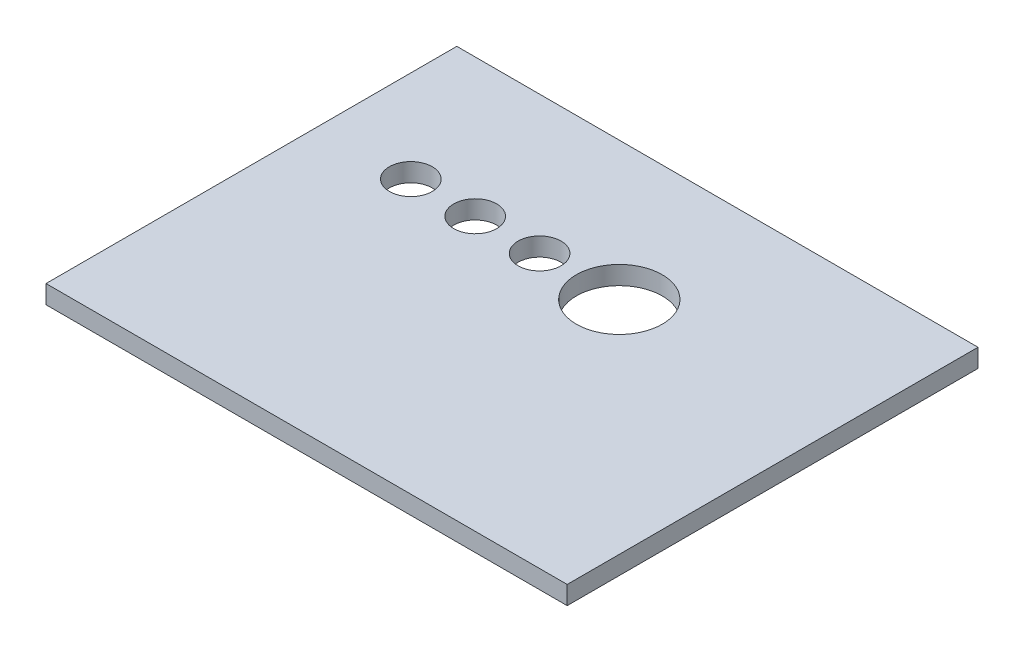
ISO-10303-21;
HEADER;
FILE_DESCRIPTION(('STEP AP214'),'2;1');
FILE_NAME('part.step','',(''),(''),'','','');
FILE_SCHEMA(('AUTOMOTIVE_DESIGN { 1 0 10303 214 1 1 1 1 }'));
ENDSEC;
DATA;
#1=APPLICATION_CONTEXT('core data for automotive mechanical design processes');
#2=APPLICATION_PROTOCOL_DEFINITION('international standard','automotive_design',2000,#1);
#3=PRODUCT_CONTEXT('',#1,'mechanical');
#4=PRODUCT('Part','Part','',(#3));
#5=PRODUCT_RELATED_PRODUCT_CATEGORY('part','',(#4));
#6=PRODUCT_DEFINITION_FORMATION('','',#4);
#7=PRODUCT_DEFINITION_CONTEXT('part definition',#1,'design');
#8=PRODUCT_DEFINITION('design','',#6,#7);
#9=PRODUCT_DEFINITION_SHAPE('','',#8);
#10=(LENGTH_UNIT() NAMED_UNIT(*) SI_UNIT(.MILLI.,.METRE.));
#11=(NAMED_UNIT(*) PLANE_ANGLE_UNIT() SI_UNIT($,.RADIAN.));
#12=(NAMED_UNIT(*) SI_UNIT($,.STERADIAN.) SOLID_ANGLE_UNIT());
#13=UNCERTAINTY_MEASURE_WITH_UNIT(LENGTH_MEASURE(1.E-05),#10,'distance_accuracy_value','');
#14=(GEOMETRIC_REPRESENTATION_CONTEXT(3) GLOBAL_UNCERTAINTY_ASSIGNED_CONTEXT((#13)) GLOBAL_UNIT_ASSIGNED_CONTEXT((#10,
#11,#12)) REPRESENTATION_CONTEXT('',''));
#15=CARTESIAN_POINT('',(0.,0.,0.));
#16=DIRECTION('',(0.,0.,1.));
#17=DIRECTION('',(1.,0.,0.));
#18=AXIS2_PLACEMENT_3D('',#15,#16,#17);
#19=CARTESIAN_POINT('',(0.,3.,0.));
#20=DIRECTION('',(0.,1.,0.));
#21=DIRECTION('',(0.,0.,1.));
#22=AXIS2_PLACEMENT_3D('',#19,#20,#21);
#23=PLANE('',#22);
#24=CARTESIAN_POINT('',(-6.5,3.,-11.));
#25=DIRECTION('',(0.,1.,0.));
#26=DIRECTION('',(0.,0.,1.));
#27=AXIS2_PLACEMENT_3D('',#24,#25,#26);
#28=CIRCLE('',#27,3.5);
#29=CARTESIAN_POINT('',(-6.5,3.,-7.5));
#30=VERTEX_POINT('',#29);
#31=EDGE_CURVE('E125',#30,#30,#28,.T.);
#32=ORIENTED_EDGE('',*,*,#31,.F.);
#33=EDGE_LOOP('',(#32));
#34=FACE_BOUND('',#33,.T.);
#35=CARTESIAN_POINT('',(-27.5,3.,-11.));
#36=DIRECTION('',(0.,1.,0.));
#37=DIRECTION('',(0.,0.,1.));
#38=AXIS2_PLACEMENT_3D('',#35,#36,#37);
#39=CIRCLE('',#38,3.5);
#40=CARTESIAN_POINT('',(-27.5,3.,-7.5));
#41=VERTEX_POINT('',#40);
#42=EDGE_CURVE('E104',#41,#41,#39,.T.);
#43=ORIENTED_EDGE('',*,*,#42,.F.);
#44=EDGE_LOOP('',(#43));
#45=FACE_BOUND('',#44,.T.);
#46=DIRECTION('',(0.,0.,1.));
#47=VECTOR('',#46,1.);
#48=CARTESIAN_POINT('',(-42.5,3.,33.5));
#49=LINE('',#48,#47);
#50=CARTESIAN_POINT('',(-42.5,3.,-33.5));
#51=VERTEX_POINT('',#50);
#52=CARTESIAN_POINT('',(-42.5,3.,33.5));
#53=VERTEX_POINT('',#52);
#54=EDGE_CURVE('E89',#51,#53,#49,.T.);
#55=ORIENTED_EDGE('',*,*,#54,.T.);
#56=DIRECTION('',(1.,0.,0.));
#57=VECTOR('',#56,1.);
#58=CARTESIAN_POINT('',(42.5,3.,33.5));
#59=LINE('',#58,#57);
#60=CARTESIAN_POINT('',(42.5,3.,33.5));
#61=VERTEX_POINT('',#60);
#62=EDGE_CURVE('E84',#53,#61,#59,.T.);
#63=ORIENTED_EDGE('',*,*,#62,.T.);
#64=DIRECTION('',(0.,0.,-1.));
#65=VECTOR('',#64,1.);
#66=CARTESIAN_POINT('',(42.5,3.,33.5));
#67=LINE('',#66,#65);
#68=CARTESIAN_POINT('',(42.5,3.,-33.5));
#69=VERTEX_POINT('',#68);
#70=EDGE_CURVE('E87',#61,#69,#67,.T.);
#71=ORIENTED_EDGE('',*,*,#70,.T.);
#72=DIRECTION('',(-1.,0.,0.));
#73=VECTOR('',#72,1.);
#74=CARTESIAN_POINT('',(42.5,3.,-33.5));
#75=LINE('',#74,#73);
#76=EDGE_CURVE('E54',#69,#51,#75,.T.);
#77=ORIENTED_EDGE('',*,*,#76,.T.);
#78=EDGE_LOOP('',(#55,#63,#71,#77));
#79=FACE_BOUND('',#78,.T.);
#80=CARTESIAN_POINT('',(-17.,3.,-11.));
#81=DIRECTION('',(0.,1.,0.));
#82=DIRECTION('',(0.,0.,1.));
#83=AXIS2_PLACEMENT_3D('',#80,#81,#82);
#84=CIRCLE('',#83,3.5);
#85=CARTESIAN_POINT('',(-17.,3.,-7.5));
#86=VERTEX_POINT('',#85);
#87=EDGE_CURVE('E119',#86,#86,#84,.T.);
#88=ORIENTED_EDGE('',*,*,#87,.F.);
#89=EDGE_LOOP('',(#88));
#90=FACE_BOUND('',#89,.T.);
#91=CARTESIAN_POINT('',(6.5,3.,-11.));
#92=DIRECTION('',(0.,1.,0.));
#93=DIRECTION('',(0.,0.,1.));
#94=AXIS2_PLACEMENT_3D('',#91,#92,#93);
#95=CIRCLE('',#94,7.);
#96=CARTESIAN_POINT('',(6.5,3.,-4.));
#97=VERTEX_POINT('',#96);
#98=EDGE_CURVE('E131',#97,#97,#95,.T.);
#99=ORIENTED_EDGE('',*,*,#98,.F.);
#100=EDGE_LOOP('',(#99));
#101=FACE_BOUND('',#100,.T.);
#102=ADVANCED_FACE('F37',(#34,#45,#79,#90,#101),#23,.T.);
#103=CARTESIAN_POINT('',(0.,0.,0.));
#104=DIRECTION('',(0.,1.,0.));
#105=DIRECTION('',(0.,0.,1.));
#106=AXIS2_PLACEMENT_3D('',#103,#104,#105);
#107=PLANE('',#106);
#108=DIRECTION('',(0.,0.,1.));
#109=VECTOR('',#108,1.);
#110=CARTESIAN_POINT('',(-42.5,0.,33.5));
#111=LINE('',#110,#109);
#112=CARTESIAN_POINT('',(-42.5,0.,-33.5));
#113=VERTEX_POINT('',#112);
#114=CARTESIAN_POINT('',(-42.5,0.,33.5));
#115=VERTEX_POINT('',#114);
#116=EDGE_CURVE('E101',#113,#115,#111,.T.);
#117=ORIENTED_EDGE('',*,*,#116,.F.);
#118=DIRECTION('',(-1.,0.,0.));
#119=VECTOR('',#118,1.);
#120=CARTESIAN_POINT('',(42.5,0.,-33.5));
#121=LINE('',#120,#119);
#122=CARTESIAN_POINT('',(42.5,0.,-33.5));
#123=VERTEX_POINT('',#122);
#124=EDGE_CURVE('E77',#123,#113,#121,.T.);
#125=ORIENTED_EDGE('',*,*,#124,.F.);
#126=DIRECTION('',(0.,0.,-1.));
#127=VECTOR('',#126,1.);
#128=CARTESIAN_POINT('',(42.5,0.,33.5));
#129=LINE('',#128,#127);
#130=CARTESIAN_POINT('',(42.5,0.,33.5));
#131=VERTEX_POINT('',#130);
#132=EDGE_CURVE('E71',#131,#123,#129,.T.);
#133=ORIENTED_EDGE('',*,*,#132,.F.);
#134=DIRECTION('',(1.,0.,0.));
#135=VECTOR('',#134,1.);
#136=CARTESIAN_POINT('',(42.5,0.,33.5));
#137=LINE('',#136,#135);
#138=EDGE_CURVE('E93',#115,#131,#137,.T.);
#139=ORIENTED_EDGE('',*,*,#138,.F.);
#140=EDGE_LOOP('',(#117,#125,#133,#139));
#141=FACE_BOUND('',#140,.T.);
#142=CARTESIAN_POINT('',(-27.5,0.,-11.));
#143=DIRECTION('',(0.,1.,0.));
#144=DIRECTION('',(0.,0.,1.));
#145=AXIS2_PLACEMENT_3D('',#142,#143,#144);
#146=CIRCLE('',#145,3.5);
#147=CARTESIAN_POINT('',(-27.5,0.,-7.5));
#148=VERTEX_POINT('',#147);
#149=EDGE_CURVE('E116',#148,#148,#146,.T.);
#150=ORIENTED_EDGE('',*,*,#149,.T.);
#151=EDGE_LOOP('',(#150));
#152=FACE_BOUND('',#151,.T.);
#153=CARTESIAN_POINT('',(-17.,0.,-11.));
#154=DIRECTION('',(0.,1.,0.));
#155=DIRECTION('',(0.,0.,1.));
#156=AXIS2_PLACEMENT_3D('',#153,#154,#155);
#157=CIRCLE('',#156,3.5);
#158=CARTESIAN_POINT('',(-17.,0.,-7.5));
#159=VERTEX_POINT('',#158);
#160=EDGE_CURVE('E122',#159,#159,#157,.T.);
#161=ORIENTED_EDGE('',*,*,#160,.T.);
#162=EDGE_LOOP('',(#161));
#163=FACE_BOUND('',#162,.T.);
#164=CARTESIAN_POINT('',(-6.5,0.,-11.));
#165=DIRECTION('',(0.,1.,0.));
#166=DIRECTION('',(0.,0.,1.));
#167=AXIS2_PLACEMENT_3D('',#164,#165,#166);
#168=CIRCLE('',#167,3.5);
#169=CARTESIAN_POINT('',(-6.5,0.,-7.5));
#170=VERTEX_POINT('',#169);
#171=EDGE_CURVE('E128',#170,#170,#168,.T.);
#172=ORIENTED_EDGE('',*,*,#171,.T.);
#173=EDGE_LOOP('',(#172));
#174=FACE_BOUND('',#173,.T.);
#175=CARTESIAN_POINT('',(6.5,0.,-11.));
#176=DIRECTION('',(0.,1.,0.));
#177=DIRECTION('',(0.,0.,1.));
#178=AXIS2_PLACEMENT_3D('',#175,#176,#177);
#179=CIRCLE('',#178,7.);
#180=CARTESIAN_POINT('',(6.5,0.,-4.));
#181=VERTEX_POINT('',#180);
#182=EDGE_CURVE('E134',#181,#181,#179,.T.);
#183=ORIENTED_EDGE('',*,*,#182,.T.);
#184=EDGE_LOOP('',(#183));
#185=FACE_BOUND('',#184,.T.);
#186=ADVANCED_FACE('F112',(#141,#152,#163,#174,#185),#107,.F.);
#187=CARTESIAN_POINT('',(-42.5,3.,33.5));
#188=DIRECTION('',(1.,0.,0.));
#189=DIRECTION('',(0.,0.,-1.));
#190=AXIS2_PLACEMENT_3D('',#187,#188,#189);
#191=PLANE('',#190);
#192=ORIENTED_EDGE('',*,*,#116,.T.);
#193=DIRECTION('',(0.,-1.,0.));
#194=VECTOR('',#193,1.);
#195=CARTESIAN_POINT('',(-42.5,3.,33.5));
#196=LINE('',#195,#194);
#197=EDGE_CURVE('E11',#53,#115,#196,.T.);
#198=ORIENTED_EDGE('',*,*,#197,.F.);
#199=ORIENTED_EDGE('',*,*,#54,.F.);
#200=DIRECTION('',(0.,-1.,0.));
#201=VECTOR('',#200,1.);
#202=CARTESIAN_POINT('',(-42.5,3.,-33.5));
#203=LINE('',#202,#201);
#204=EDGE_CURVE('E97',#51,#113,#203,.T.);
#205=ORIENTED_EDGE('',*,*,#204,.T.);
#206=EDGE_LOOP('',(#192,#198,#199,#205));
#207=FACE_BOUND('',#206,.T.);
#208=ADVANCED_FACE('F39',(#207),#191,.F.);
#209=CARTESIAN_POINT('',(42.5,3.,33.5));
#210=DIRECTION('',(0.,0.,-1.));
#211=DIRECTION('',(-1.,0.,0.));
#212=AXIS2_PLACEMENT_3D('',#209,#210,#211);
#213=PLANE('',#212);
#214=ORIENTED_EDGE('',*,*,#138,.T.);
#215=DIRECTION('',(0.,-1.,0.));
#216=VECTOR('',#215,1.);
#217=CARTESIAN_POINT('',(42.5,3.,33.5));
#218=LINE('',#217,#216);
#219=EDGE_CURVE('E46',#61,#131,#218,.T.);
#220=ORIENTED_EDGE('',*,*,#219,.F.);
#221=ORIENTED_EDGE('',*,*,#62,.F.);
#222=ORIENTED_EDGE('',*,*,#197,.T.);
#223=EDGE_LOOP('',(#214,#220,#221,#222));
#224=FACE_BOUND('',#223,.T.);
#225=ADVANCED_FACE('F92',(#224),#213,.F.);
#226=CARTESIAN_POINT('',(42.5,3.,33.5));
#227=DIRECTION('',(-1.,0.,0.));
#228=DIRECTION('',(0.,0.,1.));
#229=AXIS2_PLACEMENT_3D('',#226,#227,#228);
#230=PLANE('',#229);
#231=ORIENTED_EDGE('',*,*,#132,.T.);
#232=DIRECTION('',(0.,-1.,0.));
#233=VECTOR('',#232,1.);
#234=CARTESIAN_POINT('',(42.5,3.,-33.5));
#235=LINE('',#234,#233);
#236=EDGE_CURVE('E94',#69,#123,#235,.T.);
#237=ORIENTED_EDGE('',*,*,#236,.F.);
#238=ORIENTED_EDGE('',*,*,#70,.F.);
#239=ORIENTED_EDGE('',*,*,#219,.T.);
#240=EDGE_LOOP('',(#231,#237,#238,#239));
#241=FACE_BOUND('',#240,.T.);
#242=ADVANCED_FACE('F95',(#241),#230,.F.);
#243=CARTESIAN_POINT('',(42.5,3.,-33.5));
#244=DIRECTION('',(0.,0.,1.));
#245=DIRECTION('',(1.,0.,0.));
#246=AXIS2_PLACEMENT_3D('',#243,#244,#245);
#247=PLANE('',#246);
#248=ORIENTED_EDGE('',*,*,#124,.T.);
#249=ORIENTED_EDGE('',*,*,#204,.F.);
#250=ORIENTED_EDGE('',*,*,#76,.F.);
#251=ORIENTED_EDGE('',*,*,#236,.T.);
#252=EDGE_LOOP('',(#248,#249,#250,#251));
#253=FACE_BOUND('',#252,.T.);
#254=ADVANCED_FACE('F109',(#253),#247,.F.);
#255=CARTESIAN_POINT('',(-27.5,3.,-11.));
#256=DIRECTION('',(0.,-1.,0.));
#257=DIRECTION('',(0.,0.,-1.));
#258=AXIS2_PLACEMENT_3D('',#255,#256,#257);
#259=CYLINDRICAL_SURFACE('',#258,3.5);
#260=ORIENTED_EDGE('',*,*,#42,.T.);
#261=EDGE_LOOP('',(#260));
#262=FACE_BOUND('',#261,.T.);
#263=ORIENTED_EDGE('',*,*,#149,.F.);
#264=EDGE_LOOP('',(#263));
#265=FACE_BOUND('',#264,.T.);
#266=ADVANCED_FACE('F153',(#262,#265),#259,.F.);
#267=CARTESIAN_POINT('',(-17.,3.,-11.));
#268=DIRECTION('',(0.,-1.,0.));
#269=DIRECTION('',(0.,0.,-1.));
#270=AXIS2_PLACEMENT_3D('',#267,#268,#269);
#271=CYLINDRICAL_SURFACE('',#270,3.5);
#272=ORIENTED_EDGE('',*,*,#87,.T.);
#273=EDGE_LOOP('',(#272));
#274=FACE_BOUND('',#273,.T.);
#275=ORIENTED_EDGE('',*,*,#160,.F.);
#276=EDGE_LOOP('',(#275));
#277=FACE_BOUND('',#276,.T.);
#278=ADVANCED_FACE('F207',(#274,#277),#271,.F.);
#279=CARTESIAN_POINT('',(-6.5,3.,-11.));
#280=DIRECTION('',(0.,-1.,0.));
#281=DIRECTION('',(0.,0.,-1.));
#282=AXIS2_PLACEMENT_3D('',#279,#280,#281);
#283=CYLINDRICAL_SURFACE('',#282,3.5);
#284=ORIENTED_EDGE('',*,*,#31,.T.);
#285=EDGE_LOOP('',(#284));
#286=FACE_BOUND('',#285,.T.);
#287=ORIENTED_EDGE('',*,*,#171,.F.);
#288=EDGE_LOOP('',(#287));
#289=FACE_BOUND('',#288,.T.);
#290=ADVANCED_FACE('F216',(#286,#289),#283,.F.);
#291=CARTESIAN_POINT('',(6.5,3.,-11.));
#292=DIRECTION('',(0.,-1.,0.));
#293=DIRECTION('',(0.,0.,-1.));
#294=AXIS2_PLACEMENT_3D('',#291,#292,#293);
#295=CYLINDRICAL_SURFACE('',#294,7.);
#296=ORIENTED_EDGE('',*,*,#98,.T.);
#297=EDGE_LOOP('',(#296));
#298=FACE_BOUND('',#297,.T.);
#299=ORIENTED_EDGE('',*,*,#182,.F.);
#300=EDGE_LOOP('',(#299));
#301=FACE_BOUND('',#300,.T.);
#302=ADVANCED_FACE('F140',(#298,#301),#295,.F.);
#303=CLOSED_SHELL('',(#102,#186,#208,#225,#242,#254,#266,#278,#290,#302));
#304=MANIFOLD_SOLID_BREP('B2',#303);
#305=ADVANCED_BREP_SHAPE_REPRESENTATION('',(#18,#304),#14);
#306=SHAPE_DEFINITION_REPRESENTATION(#9,#305);
ENDSEC;
END-ISO-10303-21;
